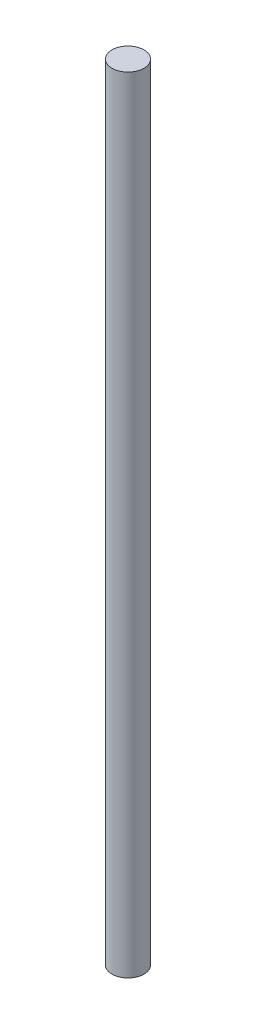
ISO-10303-21;
HEADER;
FILE_DESCRIPTION(('STEP AP214'),'2;1');
FILE_NAME('part.step','',(''),(''),'','','');
FILE_SCHEMA(('AUTOMOTIVE_DESIGN { 1 0 10303 214 1 1 1 1 }'));
ENDSEC;
DATA;
#1=APPLICATION_CONTEXT('core data for automotive mechanical design processes');
#2=APPLICATION_PROTOCOL_DEFINITION('international standard','automotive_design',2000,#1);
#3=PRODUCT_CONTEXT('',#1,'mechanical');
#4=PRODUCT('Part','Part','',(#3));
#5=PRODUCT_RELATED_PRODUCT_CATEGORY('part','',(#4));
#6=PRODUCT_DEFINITION_FORMATION('','',#4);
#7=PRODUCT_DEFINITION_CONTEXT('part definition',#1,'design');
#8=PRODUCT_DEFINITION('design','',#6,#7);
#9=PRODUCT_DEFINITION_SHAPE('','',#8);
#10=(LENGTH_UNIT() NAMED_UNIT(*) SI_UNIT(.MILLI.,.METRE.));
#11=(NAMED_UNIT(*) PLANE_ANGLE_UNIT() SI_UNIT($,.RADIAN.));
#12=(NAMED_UNIT(*) SI_UNIT($,.STERADIAN.) SOLID_ANGLE_UNIT());
#13=UNCERTAINTY_MEASURE_WITH_UNIT(LENGTH_MEASURE(1.E-05),#10,'distance_accuracy_value','');
#14=(GEOMETRIC_REPRESENTATION_CONTEXT(3) GLOBAL_UNCERTAINTY_ASSIGNED_CONTEXT((#13)) GLOBAL_UNIT_ASSIGNED_CONTEXT((#10,
#11,#12)) REPRESENTATION_CONTEXT('',''));
#15=CARTESIAN_POINT('',(0.,0.,0.));
#16=DIRECTION('',(0.,0.,1.));
#17=DIRECTION('',(1.,0.,0.));
#18=AXIS2_PLACEMENT_3D('',#15,#16,#17);
#19=CARTESIAN_POINT('',(0.,40.,0.));
#20=DIRECTION('',(0.,-1.,0.));
#21=DIRECTION('',(0.,0.,-1.));
#22=AXIS2_PLACEMENT_3D('',#19,#20,#21);
#23=CYLINDRICAL_SURFACE('',#22,0.815);
#24=CARTESIAN_POINT('',(0.,40.,0.));
#25=DIRECTION('',(0.,1.,0.));
#26=DIRECTION('',(0.,0.,1.));
#27=AXIS2_PLACEMENT_3D('',#24,#25,#26);
#28=CIRCLE('',#27,0.815);
#29=CARTESIAN_POINT('',(0.,40.,0.815));
#30=VERTEX_POINT('',#29);
#31=EDGE_CURVE('E10',#30,#30,#28,.T.);
#32=ORIENTED_EDGE('',*,*,#31,.F.);
#33=EDGE_LOOP('',(#32));
#34=FACE_BOUND('',#33,.T.);
#35=CARTESIAN_POINT('',(0.,0.,0.));
#36=DIRECTION('',(0.,1.,0.));
#37=DIRECTION('',(0.,0.,1.));
#38=AXIS2_PLACEMENT_3D('',#35,#36,#37);
#39=CIRCLE('',#38,0.815);
#40=CARTESIAN_POINT('',(0.,0.,0.815));
#41=VERTEX_POINT('',#40);
#42=EDGE_CURVE('E40',#41,#41,#39,.T.);
#43=ORIENTED_EDGE('',*,*,#42,.T.);
#44=EDGE_LOOP('',(#43));
#45=FACE_BOUND('',#44,.T.);
#46=ADVANCED_FACE('F37',(#34,#45),#23,.T.);
#47=CARTESIAN_POINT('',(0.,40.,0.));
#48=DIRECTION('',(0.,1.,0.));
#49=DIRECTION('',(0.,0.,1.));
#50=AXIS2_PLACEMENT_3D('',#47,#48,#49);
#51=PLANE('',#50);
#52=ORIENTED_EDGE('',*,*,#31,.T.);
#53=EDGE_LOOP('',(#52));
#54=FACE_BOUND('',#53,.T.);
#55=ADVANCED_FACE('F52',(#54),#51,.T.);
#56=CARTESIAN_POINT('',(0.,0.,0.));
#57=DIRECTION('',(0.,1.,0.));
#58=DIRECTION('',(0.,0.,1.));
#59=AXIS2_PLACEMENT_3D('',#56,#57,#58);
#60=PLANE('',#59);
#61=ORIENTED_EDGE('',*,*,#42,.F.);
#62=EDGE_LOOP('',(#61));
#63=FACE_BOUND('',#62,.T.);
#64=ADVANCED_FACE('F50',(#63),#60,.F.);
#65=CLOSED_SHELL('',(#46,#55,#64));
#66=MANIFOLD_SOLID_BREP('B2',#65);
#67=ADVANCED_BREP_SHAPE_REPRESENTATION('',(#18,#66),#14);
#68=SHAPE_DEFINITION_REPRESENTATION(#9,#67);
ENDSEC;
END-ISO-10303-21;
